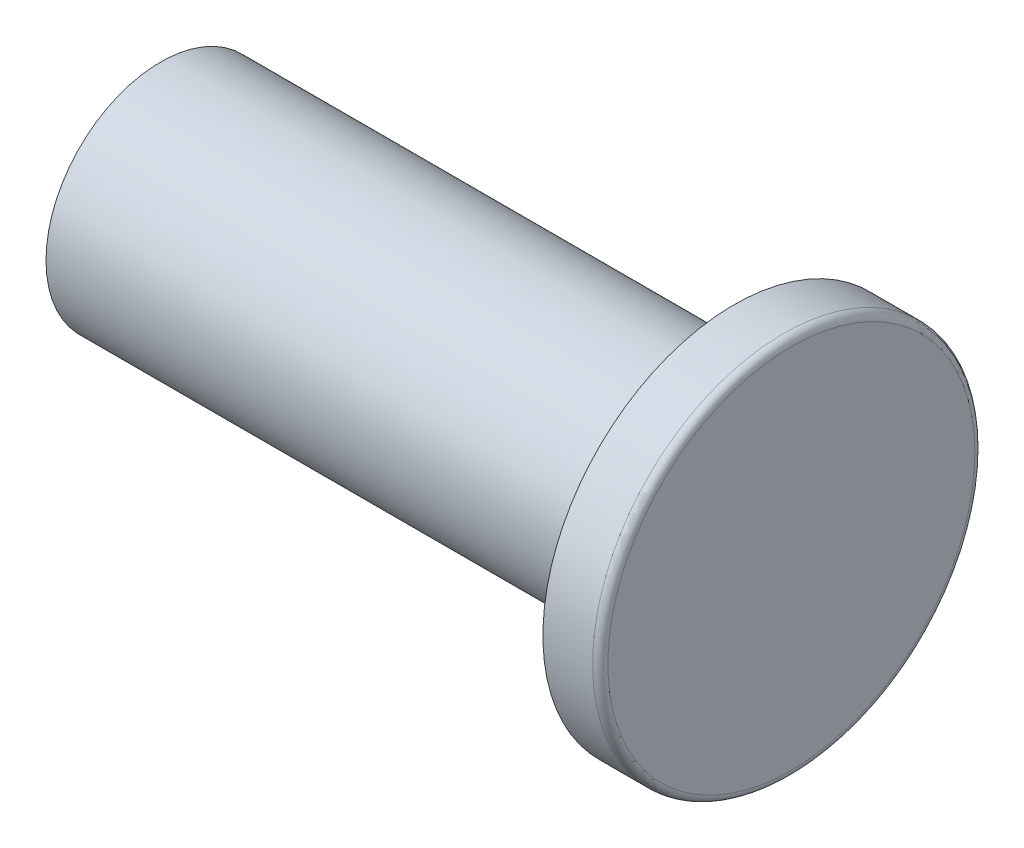
ISO-10303-21;
HEADER;
FILE_DESCRIPTION(('STEP AP214'),'2;1');
FILE_NAME('part.step','',(''),(''),'','','');
FILE_SCHEMA(('AUTOMOTIVE_DESIGN { 1 0 10303 214 1 1 1 1 }'));
ENDSEC;
DATA;
#1=APPLICATION_CONTEXT('core data for automotive mechanical design processes');
#2=APPLICATION_PROTOCOL_DEFINITION('international standard','automotive_design',2000,#1);
#3=PRODUCT_CONTEXT('',#1,'mechanical');
#4=PRODUCT('Part','Part','',(#3));
#5=PRODUCT_RELATED_PRODUCT_CATEGORY('part','',(#4));
#6=PRODUCT_DEFINITION_FORMATION('','',#4);
#7=PRODUCT_DEFINITION_CONTEXT('part definition',#1,'design');
#8=PRODUCT_DEFINITION('design','',#6,#7);
#9=PRODUCT_DEFINITION_SHAPE('','',#8);
#10=(LENGTH_UNIT() NAMED_UNIT(*) SI_UNIT(.MILLI.,.METRE.));
#11=(NAMED_UNIT(*) PLANE_ANGLE_UNIT() SI_UNIT($,.RADIAN.));
#12=(NAMED_UNIT(*) SI_UNIT($,.STERADIAN.) SOLID_ANGLE_UNIT());
#13=UNCERTAINTY_MEASURE_WITH_UNIT(LENGTH_MEASURE(1.E-05),#10,'distance_accuracy_value','');
#14=(GEOMETRIC_REPRESENTATION_CONTEXT(3) GLOBAL_UNCERTAINTY_ASSIGNED_CONTEXT((#13)) GLOBAL_UNIT_ASSIGNED_CONTEXT((#10,
#11,#12)) REPRESENTATION_CONTEXT('',''));
#15=CARTESIAN_POINT('',(0.,0.,0.));
#16=DIRECTION('',(0.,0.,1.));
#17=DIRECTION('',(1.,0.,0.));
#18=AXIS2_PLACEMENT_3D('',#15,#16,#17);
#19=CARTESIAN_POINT('',(750.,0.,0.));
#20=DIRECTION('',(-1.,0.,0.));
#21=DIRECTION('',(0.,0.,1.));
#22=AXIS2_PLACEMENT_3D('',#19,#20,#21);
#23=CYLINDRICAL_SURFACE('',#22,150.);
#24=CARTESIAN_POINT('',(750.,0.,0.));
#25=DIRECTION('',(1.,0.,0.));
#26=DIRECTION('',(0.,0.,-1.));
#27=AXIS2_PLACEMENT_3D('',#24,#25,#26);
#28=CIRCLE('',#27,150.);
#29=CARTESIAN_POINT('',(750.,0.,-150.));
#30=VERTEX_POINT('',#29);
#31=EDGE_CURVE('E48',#30,#30,#28,.T.);
#32=ORIENTED_EDGE('',*,*,#31,.F.);
#33=EDGE_LOOP('',(#32));
#34=FACE_BOUND('',#33,.T.);
#35=CARTESIAN_POINT('',(0.,0.,0.));
#36=DIRECTION('',(1.,0.,0.));
#37=DIRECTION('',(0.,0.,-1.));
#38=AXIS2_PLACEMENT_3D('',#35,#36,#37);
#39=CIRCLE('',#38,150.);
#40=CARTESIAN_POINT('',(0.,0.,-150.));
#41=VERTEX_POINT('',#40);
#42=EDGE_CURVE('E52',#41,#41,#39,.T.);
#43=ORIENTED_EDGE('',*,*,#42,.T.);
#44=EDGE_LOOP('',(#43));
#45=FACE_BOUND('',#44,.T.);
#46=ADVANCED_FACE('F37',(#34,#45),#23,.T.);
#47=CARTESIAN_POINT('',(0.,0.,0.));
#48=DIRECTION('',(1.,0.,0.));
#49=DIRECTION('',(0.,0.,-1.));
#50=AXIS2_PLACEMENT_3D('',#47,#48,#49);
#51=PLANE('',#50);
#52=ORIENTED_EDGE('',*,*,#42,.F.);
#53=EDGE_LOOP('',(#52));
#54=FACE_BOUND('',#53,.T.);
#55=ADVANCED_FACE('F78',(#54),#51,.F.);
#56=CARTESIAN_POINT('',(825.,0.,0.));
#57=DIRECTION('',(-1.,0.,0.));
#58=DIRECTION('',(0.,0.,1.));
#59=AXIS2_PLACEMENT_3D('',#56,#57,#58);
#60=CYLINDRICAL_SURFACE('',#59,250.);
#61=CARTESIAN_POINT('',(815.,0.,0.));
#62=DIRECTION('',(1.,0.,0.));
#63=DIRECTION('',(0.,0.,-1.));
#64=AXIS2_PLACEMENT_3D('',#61,#62,#63);
#65=CIRCLE('',#64,250.);
#66=CARTESIAN_POINT('',(815.,0.,-250.));
#67=VERTEX_POINT('',#66);
#68=EDGE_CURVE('E10',#67,#67,#65,.F.);
#69=ORIENTED_EDGE('',*,*,#68,.T.);
#70=EDGE_LOOP('',(#69));
#71=FACE_BOUND('',#70,.T.);
#72=CARTESIAN_POINT('',(750.,0.,0.));
#73=DIRECTION('',(1.,0.,0.));
#74=DIRECTION('',(0.,0.,-1.));
#75=AXIS2_PLACEMENT_3D('',#72,#73,#74);
#76=CIRCLE('',#75,250.);
#77=CARTESIAN_POINT('',(750.,0.,-250.));
#78=VERTEX_POINT('',#77);
#79=EDGE_CURVE('E56',#78,#78,#76,.T.);
#80=ORIENTED_EDGE('',*,*,#79,.T.);
#81=EDGE_LOOP('',(#80));
#82=FACE_BOUND('',#81,.T.);
#83=ADVANCED_FACE('F61',(#71,#82),#60,.T.);
#84=CARTESIAN_POINT('',(825.,0.,0.));
#85=DIRECTION('',(1.,0.,0.));
#86=DIRECTION('',(0.,0.,-1.));
#87=AXIS2_PLACEMENT_3D('',#84,#85,#86);
#88=PLANE('',#87);
#89=CARTESIAN_POINT('',(825.,0.,0.));
#90=DIRECTION('',(1.,0.,0.));
#91=DIRECTION('',(0.,0.,-1.));
#92=AXIS2_PLACEMENT_3D('',#89,#90,#91);
#93=CIRCLE('',#92,240.);
#94=CARTESIAN_POINT('',(825.,0.,-240.));
#95=VERTEX_POINT('',#94);
#96=EDGE_CURVE('E44',#95,#95,#93,.T.);
#97=ORIENTED_EDGE('',*,*,#96,.T.);
#98=EDGE_LOOP('',(#97));
#99=FACE_BOUND('',#98,.T.);
#100=ADVANCED_FACE('F65',(#99),#88,.T.);
#101=CARTESIAN_POINT('',(750.,0.,0.));
#102=DIRECTION('',(1.,0.,0.));
#103=DIRECTION('',(0.,0.,-1.));
#104=AXIS2_PLACEMENT_3D('',#101,#102,#103);
#105=PLANE('',#104);
#106=ORIENTED_EDGE('',*,*,#31,.T.);
#107=EDGE_LOOP('',(#106));
#108=FACE_BOUND('',#107,.T.);
#109=ORIENTED_EDGE('',*,*,#79,.F.);
#110=EDGE_LOOP('',(#109));
#111=FACE_BOUND('',#110,.T.);
#112=ADVANCED_FACE('F63',(#108,#111),#105,.F.);
#113=CARTESIAN_POINT('',(815.,0.,0.));
#114=DIRECTION('',(1.,0.,0.));
#115=DIRECTION('',(0.,0.,-1.));
#116=AXIS2_PLACEMENT_3D('',#113,#114,#115);
#117=TOROIDAL_SURFACE('',#116,240.,10.);
#118=ORIENTED_EDGE('',*,*,#68,.F.);
#119=EDGE_LOOP('',(#118));
#120=FACE_BOUND('',#119,.T.);
#121=ORIENTED_EDGE('',*,*,#96,.F.);
#122=EDGE_LOOP('',(#121));
#123=FACE_BOUND('',#122,.T.);
#124=ADVANCED_FACE('F39',(#120,#123),#117,.T.);
#125=CLOSED_SHELL('',(#46,#55,#83,#100,#112,#124));
#126=MANIFOLD_SOLID_BREP('B2',#125);
#127=ADVANCED_BREP_SHAPE_REPRESENTATION('',(#18,#126),#14);
#128=SHAPE_DEFINITION_REPRESENTATION(#9,#127);
ENDSEC;
END-ISO-10303-21;
